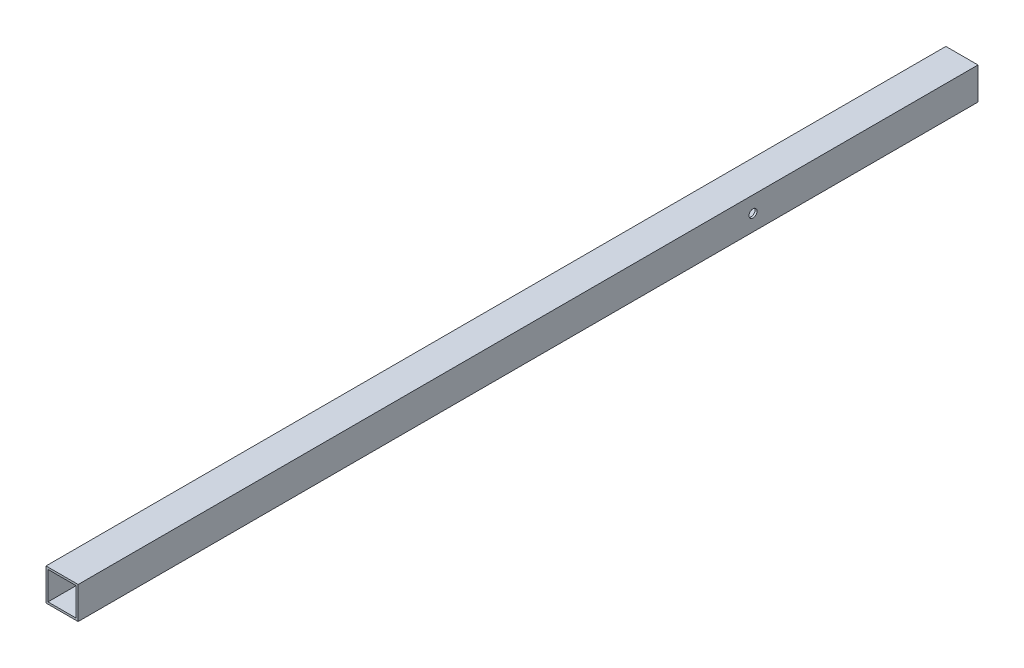
ISO-10303-21;
HEADER;
FILE_DESCRIPTION(('STEP AP214'),'2;1');
FILE_NAME('part.step','',(''),(''),'','','');
FILE_SCHEMA(('AUTOMOTIVE_DESIGN { 1 0 10303 214 1 1 1 1 }'));
ENDSEC;
DATA;
#1=APPLICATION_CONTEXT('core data for automotive mechanical design processes');
#2=APPLICATION_PROTOCOL_DEFINITION('international standard','automotive_design',2000,#1);
#3=PRODUCT_CONTEXT('',#1,'mechanical');
#4=PRODUCT('Part','Part','',(#3));
#5=PRODUCT_RELATED_PRODUCT_CATEGORY('part','',(#4));
#6=PRODUCT_DEFINITION_FORMATION('','',#4);
#7=PRODUCT_DEFINITION_CONTEXT('part definition',#1,'design');
#8=PRODUCT_DEFINITION('design','',#6,#7);
#9=PRODUCT_DEFINITION_SHAPE('','',#8);
#10=(LENGTH_UNIT() NAMED_UNIT(*) SI_UNIT(.MILLI.,.METRE.));
#11=(NAMED_UNIT(*) PLANE_ANGLE_UNIT() SI_UNIT($,.RADIAN.));
#12=(NAMED_UNIT(*) SI_UNIT($,.STERADIAN.) SOLID_ANGLE_UNIT());
#13=UNCERTAINTY_MEASURE_WITH_UNIT(LENGTH_MEASURE(1.E-05),#10,'distance_accuracy_value','');
#14=(GEOMETRIC_REPRESENTATION_CONTEXT(3) GLOBAL_UNCERTAINTY_ASSIGNED_CONTEXT((#13)) GLOBAL_UNIT_ASSIGNED_CONTEXT((#10,
#11,#12)) REPRESENTATION_CONTEXT('',''));
#15=CARTESIAN_POINT('',(0.,0.,0.));
#16=DIRECTION('',(0.,0.,1.));
#17=DIRECTION('',(1.,0.,0.));
#18=AXIS2_PLACEMENT_3D('',#15,#16,#17);
#19=CARTESIAN_POINT('',(-12.7,-12.7,914.4));
#20=DIRECTION('',(0.,1.,0.));
#21=DIRECTION('',(0.,0.,1.));
#22=AXIS2_PLACEMENT_3D('',#19,#20,#21);
#23=PLANE('',#22);
#24=CARTESIAN_POINT('',(0.,-12.7,-584.199999999997));
#25=DIRECTION('',(0.,-1.,0.));
#26=DIRECTION('',(0.,0.,-1.));
#27=AXIS2_PLACEMENT_3D('',#24,#25,#26);
#28=CIRCLE('',#27,2.55269999999999);
#29=CARTESIAN_POINT('',(0.,-12.7,-586.752699999997));
#30=VERTEX_POINT('',#29);
#31=EDGE_CURVE('E249',#30,#30,#28,.T.);
#32=ORIENTED_EDGE('',*,*,#31,.F.);
#33=EDGE_LOOP('',(#32));
#34=FACE_BOUND('',#33,.T.);
#35=CARTESIAN_POINT('',(0.,-12.7,-533.400000000002));
#36=DIRECTION('',(0.,-1.,0.));
#37=DIRECTION('',(0.,0.,-1.));
#38=AXIS2_PLACEMENT_3D('',#35,#36,#37);
#39=CIRCLE('',#38,2.55269999999999);
#40=CARTESIAN_POINT('',(0.,-12.7,-535.952700000002));
#41=VERTEX_POINT('',#40);
#42=EDGE_CURVE('E243',#41,#41,#39,.T.);
#43=ORIENTED_EDGE('',*,*,#42,.F.);
#44=EDGE_LOOP('',(#43));
#45=FACE_BOUND('',#44,.T.);
#46=CARTESIAN_POINT('',(0.,-12.7,-482.600000000002));
#47=DIRECTION('',(0.,-1.,0.));
#48=DIRECTION('',(0.,0.,-1.));
#49=AXIS2_PLACEMENT_3D('',#46,#47,#48);
#50=CIRCLE('',#49,2.55269999999999);
#51=CARTESIAN_POINT('',(0.,-12.7,-485.152700000002));
#52=VERTEX_POINT('',#51);
#53=EDGE_CURVE('E237',#52,#52,#50,.T.);
#54=ORIENTED_EDGE('',*,*,#53,.F.);
#55=EDGE_LOOP('',(#54));
#56=FACE_BOUND('',#55,.T.);
#57=CARTESIAN_POINT('',(1.52655665885959E-13,-12.7,-254.000000000002));
#58=DIRECTION('',(0.,-1.,0.));
#59=DIRECTION('',(0.,0.,-1.));
#60=AXIS2_PLACEMENT_3D('',#57,#58,#59);
#61=CIRCLE('',#60,2.38125);
#62=CARTESIAN_POINT('',(1.52655665885959E-13,-12.7,-256.381250000002));
#63=VERTEX_POINT('',#62);
#64=EDGE_CURVE('E207',#63,#63,#61,.T.);
#65=ORIENTED_EDGE('',*,*,#64,.F.);
#66=EDGE_LOOP('',(#65));
#67=FACE_BOUND('',#66,.T.);
#68=CARTESIAN_POINT('',(0.,-12.7,-228.600000000002));
#69=DIRECTION('',(0.,-1.,0.));
#70=DIRECTION('',(0.,0.,-1.));
#71=AXIS2_PLACEMENT_3D('',#68,#69,#70);
#72=CIRCLE('',#71,2.38125);
#73=CARTESIAN_POINT('',(0.,-12.7,-230.981250000002));
#74=VERTEX_POINT('',#73);
#75=EDGE_CURVE('E201',#74,#74,#72,.T.);
#76=ORIENTED_EDGE('',*,*,#75,.F.);
#77=EDGE_LOOP('',(#76));
#78=FACE_BOUND('',#77,.T.);
#79=DIRECTION('',(1.,0.,0.));
#80=VECTOR('',#79,1.);
#81=CARTESIAN_POINT('',(-12.7,-12.7,-203.2));
#82=LINE('',#81,#80);
#83=CARTESIAN_POINT('',(-12.7,-12.7,-203.199999999999));
#84=VERTEX_POINT('',#83);
#85=CARTESIAN_POINT('',(12.7,-12.7,-203.2));
#86=VERTEX_POINT('',#85);
#87=EDGE_CURVE('E167',#84,#86,#82,.T.);
#88=ORIENTED_EDGE('',*,*,#87,.F.);
#89=DIRECTION('',(0.,0.,-1.));
#90=VECTOR('',#89,1.);
#91=CARTESIAN_POINT('',(-12.7,-12.7,914.4));
#92=LINE('',#91,#90);
#93=CARTESIAN_POINT('',(-12.7,-12.7,-914.4));
#94=VERTEX_POINT('',#93);
#95=EDGE_CURVE('E132',#84,#94,#92,.T.);
#96=ORIENTED_EDGE('',*,*,#95,.T.);
#97=DIRECTION('',(1.,0.,0.));
#98=VECTOR('',#97,1.);
#99=CARTESIAN_POINT('',(-12.7,-12.7,-914.4));
#100=LINE('',#99,#98);
#101=CARTESIAN_POINT('',(12.7,-12.7,-914.4));
#102=VERTEX_POINT('',#101);
#103=EDGE_CURVE('E125',#94,#102,#100,.T.);
#104=ORIENTED_EDGE('',*,*,#103,.T.);
#105=DIRECTION('',(0.,0.,-1.));
#106=VECTOR('',#105,1.);
#107=CARTESIAN_POINT('',(12.7,-12.7,914.4));
#108=LINE('',#107,#106);
#109=EDGE_CURVE('E130',#86,#102,#108,.T.);
#110=ORIENTED_EDGE('',*,*,#109,.F.);
#111=EDGE_LOOP('',(#88,#96,#104,#110));
#112=FACE_BOUND('',#111,.T.);
#113=CARTESIAN_POINT('',(2.4980018054066E-13,-12.7,-279.400000000002));
#114=DIRECTION('',(0.,-1.,0.));
#115=DIRECTION('',(0.,0.,-1.));
#116=AXIS2_PLACEMENT_3D('',#113,#114,#115);
#117=CIRCLE('',#116,2.38125);
#118=CARTESIAN_POINT('',(2.4980018054066E-13,-12.7,-281.781250000002));
#119=VERTEX_POINT('',#118);
#120=EDGE_CURVE('E213',#119,#119,#117,.T.);
#121=ORIENTED_EDGE('',*,*,#120,.F.);
#122=EDGE_LOOP('',(#121));
#123=FACE_BOUND('',#122,.T.);
#124=CARTESIAN_POINT('',(2.4980018054066E-13,-12.7,-838.199999999997));
#125=DIRECTION('',(0.,-1.,0.));
#126=DIRECTION('',(0.,0.,-1.));
#127=AXIS2_PLACEMENT_3D('',#124,#125,#126);
#128=CIRCLE('',#127,2.38125);
#129=CARTESIAN_POINT('',(2.4980018054066E-13,-12.7,-840.581249999997));
#130=VERTEX_POINT('',#129);
#131=EDGE_CURVE('E219',#130,#130,#128,.T.);
#132=ORIENTED_EDGE('',*,*,#131,.F.);
#133=EDGE_LOOP('',(#132));
#134=FACE_BOUND('',#133,.T.);
#135=CARTESIAN_POINT('',(1.52655665885959E-13,-12.7,-863.599999999998));
#136=DIRECTION('',(0.,-1.,0.));
#137=DIRECTION('',(0.,0.,-1.));
#138=AXIS2_PLACEMENT_3D('',#135,#136,#137);
#139=CIRCLE('',#138,2.38125);
#140=CARTESIAN_POINT('',(1.52655665885959E-13,-12.7,-865.981249999997));
#141=VERTEX_POINT('',#140);
#142=EDGE_CURVE('E225',#141,#141,#139,.T.);
#143=ORIENTED_EDGE('',*,*,#142,.F.);
#144=EDGE_LOOP('',(#143));
#145=FACE_BOUND('',#144,.T.);
#146=CARTESIAN_POINT('',(0.,-12.7,-888.999999999997));
#147=DIRECTION('',(0.,-1.,0.));
#148=DIRECTION('',(0.,0.,-1.));
#149=AXIS2_PLACEMENT_3D('',#146,#147,#148);
#150=CIRCLE('',#149,2.38125);
#151=CARTESIAN_POINT('',(0.,-12.7,-891.381249999997));
#152=VERTEX_POINT('',#151);
#153=EDGE_CURVE('E231',#152,#152,#150,.T.);
#154=ORIENTED_EDGE('',*,*,#153,.F.);
#155=EDGE_LOOP('',(#154));
#156=FACE_BOUND('',#155,.T.);
#157=CARTESIAN_POINT('',(0.,-12.7,-634.999999999997));
#158=DIRECTION('',(0.,-1.,0.));
#159=DIRECTION('',(0.,0.,-1.));
#160=AXIS2_PLACEMENT_3D('',#157,#158,#159);
#161=CIRCLE('',#160,2.55269999999999);
#162=CARTESIAN_POINT('',(0.,-12.7,-637.552699999997));
#163=VERTEX_POINT('',#162);
#164=EDGE_CURVE('E255',#163,#163,#161,.T.);
#165=ORIENTED_EDGE('',*,*,#164,.F.);
#166=EDGE_LOOP('',(#165));
#167=FACE_BOUND('',#166,.T.);
#168=ADVANCED_FACE('F38',(#34,#45,#56,#67,#78,#112,#123,#134,#145,#156,#167),#23,.F.);
#169=CARTESIAN_POINT('',(12.7,-12.7,914.4));
#170=DIRECTION('',(-1.,0.,0.));
#171=DIRECTION('',(0.,0.,1.));
#172=AXIS2_PLACEMENT_3D('',#169,#170,#171);
#173=PLANE('',#172);
#174=CARTESIAN_POINT('',(12.7,0.,-736.6));
#175=DIRECTION('',(-1.,0.,0.));
#176=DIRECTION('',(0.,0.,1.));
#177=AXIS2_PLACEMENT_3D('',#174,#175,#176);
#178=CIRCLE('',#177,3.17499999999999);
#179=CARTESIAN_POINT('',(12.7,0.,-733.425));
#180=VERTEX_POINT('',#179);
#181=EDGE_CURVE('E192',#180,#180,#178,.T.);
#182=ORIENTED_EDGE('',*,*,#181,.T.);
#183=EDGE_LOOP('',(#182));
#184=FACE_BOUND('',#183,.T.);
#185=DIRECTION('',(0.,1.,0.));
#186=VECTOR('',#185,1.);
#187=CARTESIAN_POINT('',(12.7,-12.7,-203.2));
#188=LINE('',#187,#186);
#189=CARTESIAN_POINT('',(12.7,12.7,-203.2));
#190=VERTEX_POINT('',#189);
#191=EDGE_CURVE('E171',#86,#190,#188,.T.);
#192=ORIENTED_EDGE('',*,*,#191,.F.);
#193=ORIENTED_EDGE('',*,*,#109,.T.);
#194=DIRECTION('',(0.,1.,0.));
#195=VECTOR('',#194,1.);
#196=CARTESIAN_POINT('',(12.7,-12.7,-914.4));
#197=LINE('',#196,#195);
#198=CARTESIAN_POINT('',(12.7,12.7,-914.4));
#199=VERTEX_POINT('',#198);
#200=EDGE_CURVE('E153',#102,#199,#197,.T.);
#201=ORIENTED_EDGE('',*,*,#200,.T.);
#202=DIRECTION('',(0.,0.,-1.));
#203=VECTOR('',#202,1.);
#204=CARTESIAN_POINT('',(12.7,12.7,914.4));
#205=LINE('',#204,#203);
#206=EDGE_CURVE('E47',#190,#199,#205,.T.);
#207=ORIENTED_EDGE('',*,*,#206,.F.);
#208=EDGE_LOOP('',(#192,#193,#201,#207));
#209=FACE_BOUND('',#208,.T.);
#210=ADVANCED_FACE('F40',(#184,#209),#173,.F.);
#211=CARTESIAN_POINT('',(-12.7,12.7,914.4));
#212=DIRECTION('',(0.,-1.,0.));
#213=DIRECTION('',(0.,0.,-1.));
#214=AXIS2_PLACEMENT_3D('',#211,#212,#213);
#215=PLANE('',#214);
#216=DIRECTION('',(-1.,0.,0.));
#217=VECTOR('',#216,1.);
#218=CARTESIAN_POINT('',(-12.7,12.7,-203.2));
#219=LINE('',#218,#217);
#220=CARTESIAN_POINT('',(-12.7,12.7,-203.2));
#221=VERTEX_POINT('',#220);
#222=EDGE_CURVE('E144',#190,#221,#219,.T.);
#223=ORIENTED_EDGE('',*,*,#222,.F.);
#224=ORIENTED_EDGE('',*,*,#206,.T.);
#225=DIRECTION('',(-1.,0.,0.));
#226=VECTOR('',#225,1.);
#227=CARTESIAN_POINT('',(-12.7,12.7,-914.4));
#228=LINE('',#227,#226);
#229=CARTESIAN_POINT('',(-12.7,12.7,-914.4));
#230=VERTEX_POINT('',#229);
#231=EDGE_CURVE('E143',#199,#230,#228,.T.);
#232=ORIENTED_EDGE('',*,*,#231,.T.);
#233=DIRECTION('',(0.,0.,-1.));
#234=VECTOR('',#233,1.);
#235=CARTESIAN_POINT('',(-12.7,12.7,914.4));
#236=LINE('',#235,#234);
#237=EDGE_CURVE('E134',#221,#230,#236,.T.);
#238=ORIENTED_EDGE('',*,*,#237,.F.);
#239=EDGE_LOOP('',(#223,#224,#232,#238));
#240=FACE_BOUND('',#239,.T.);
#241=ADVANCED_FACE('F141',(#240),#215,.F.);
#242=CARTESIAN_POINT('',(-12.7,-12.7,914.4));
#243=DIRECTION('',(1.,0.,0.));
#244=DIRECTION('',(0.,0.,-1.));
#245=AXIS2_PLACEMENT_3D('',#242,#243,#244);
#246=PLANE('',#245);
#247=CARTESIAN_POINT('',(-12.7,0.,-736.6));
#248=DIRECTION('',(-1.,0.,0.));
#249=DIRECTION('',(0.,0.,1.));
#250=AXIS2_PLACEMENT_3D('',#247,#248,#249);
#251=CIRCLE('',#250,3.175);
#252=CARTESIAN_POINT('',(-12.7,0.,-733.425));
#253=VERTEX_POINT('',#252);
#254=EDGE_CURVE('E195',#253,#253,#251,.T.);
#255=ORIENTED_EDGE('',*,*,#254,.F.);
#256=EDGE_LOOP('',(#255));
#257=FACE_BOUND('',#256,.T.);
#258=DIRECTION('',(0.,-1.,0.));
#259=VECTOR('',#258,1.);
#260=CARTESIAN_POINT('',(-12.7,-12.7,-203.2));
#261=LINE('',#260,#259);
#262=EDGE_CURVE('E54',#221,#84,#261,.T.);
#263=ORIENTED_EDGE('',*,*,#262,.F.);
#264=ORIENTED_EDGE('',*,*,#237,.T.);
#265=DIRECTION('',(0.,-1.,0.));
#266=VECTOR('',#265,1.);
#267=CARTESIAN_POINT('',(-12.7,-12.7,-914.4));
#268=LINE('',#267,#266);
#269=EDGE_CURVE('E156',#230,#94,#268,.T.);
#270=ORIENTED_EDGE('',*,*,#269,.T.);
#271=ORIENTED_EDGE('',*,*,#95,.F.);
#272=EDGE_LOOP('',(#263,#264,#270,#271));
#273=FACE_BOUND('',#272,.T.);
#274=ADVANCED_FACE('F169',(#257,#273),#246,.F.);
#275=CARTESIAN_POINT('',(11.1125,-11.1125,914.4));
#276=DIRECTION('',(-1.,0.,0.));
#277=DIRECTION('',(0.,0.,1.));
#278=AXIS2_PLACEMENT_3D('',#275,#276,#277);
#279=PLANE('',#278);
#280=CARTESIAN_POINT('',(11.1125,0.,-736.6));
#281=DIRECTION('',(-1.,0.,0.));
#282=DIRECTION('',(0.,0.,1.));
#283=AXIS2_PLACEMENT_3D('',#280,#281,#282);
#284=CIRCLE('',#283,3.175);
#285=CARTESIAN_POINT('',(11.1125,0.,-733.425));
#286=VERTEX_POINT('',#285);
#287=EDGE_CURVE('E42',#286,#286,#284,.T.);
#288=ORIENTED_EDGE('',*,*,#287,.F.);
#289=EDGE_LOOP('',(#288));
#290=FACE_BOUND('',#289,.T.);
#291=DIRECTION('',(0.,0.,-1.));
#292=VECTOR('',#291,1.);
#293=CARTESIAN_POINT('',(11.1125,-11.1125,914.4));
#294=LINE('',#293,#292);
#295=CARTESIAN_POINT('',(11.1125,-11.1125,-203.199999999999));
#296=VERTEX_POINT('',#295);
#297=CARTESIAN_POINT('',(11.1125,-11.1125,-914.4));
#298=VERTEX_POINT('',#297);
#299=EDGE_CURVE('E121',#296,#298,#294,.T.);
#300=ORIENTED_EDGE('',*,*,#299,.F.);
#301=DIRECTION('',(0.,1.,0.));
#302=VECTOR('',#301,1.);
#303=CARTESIAN_POINT('',(11.1125,-11.1125,-203.2));
#304=LINE('',#303,#302);
#305=CARTESIAN_POINT('',(11.1125,11.1125,-203.2));
#306=VERTEX_POINT('',#305);
#307=EDGE_CURVE('E62',#296,#306,#304,.T.);
#308=ORIENTED_EDGE('',*,*,#307,.T.);
#309=DIRECTION('',(0.,0.,-1.));
#310=VECTOR('',#309,1.);
#311=CARTESIAN_POINT('',(11.1125,11.1125,914.4));
#312=LINE('',#311,#310);
#313=CARTESIAN_POINT('',(11.1125,11.1125,-914.4));
#314=VERTEX_POINT('',#313);
#315=EDGE_CURVE('E123',#306,#314,#312,.T.);
#316=ORIENTED_EDGE('',*,*,#315,.T.);
#317=DIRECTION('',(0.,1.,0.));
#318=VECTOR('',#317,1.);
#319=CARTESIAN_POINT('',(11.1125,-11.1125,-914.4));
#320=LINE('',#319,#318);
#321=EDGE_CURVE('E177',#298,#314,#320,.T.);
#322=ORIENTED_EDGE('',*,*,#321,.F.);
#323=EDGE_LOOP('',(#300,#308,#316,#322));
#324=FACE_BOUND('',#323,.T.);
#325=ADVANCED_FACE('F273',(#290,#324),#279,.T.);
#326=CARTESIAN_POINT('',(-11.1125,11.1125,914.4));
#327=DIRECTION('',(0.,-1.,0.));
#328=DIRECTION('',(0.,0.,-1.));
#329=AXIS2_PLACEMENT_3D('',#326,#327,#328);
#330=PLANE('',#329);
#331=ORIENTED_EDGE('',*,*,#315,.F.);
#332=DIRECTION('',(-1.,0.,0.));
#333=VECTOR('',#332,1.);
#334=CARTESIAN_POINT('',(-11.1125,11.1125,-203.2));
#335=LINE('',#334,#333);
#336=CARTESIAN_POINT('',(-11.1125,11.1125,-203.2));
#337=VERTEX_POINT('',#336);
#338=EDGE_CURVE('E114',#306,#337,#335,.T.);
#339=ORIENTED_EDGE('',*,*,#338,.T.);
#340=DIRECTION('',(0.,0.,-1.));
#341=VECTOR('',#340,1.);
#342=CARTESIAN_POINT('',(-11.1125,11.1125,914.4));
#343=LINE('',#342,#341);
#344=CARTESIAN_POINT('',(-11.1125,11.1125,-914.4));
#345=VERTEX_POINT('',#344);
#346=EDGE_CURVE('E113',#337,#345,#343,.T.);
#347=ORIENTED_EDGE('',*,*,#346,.T.);
#348=DIRECTION('',(-1.,0.,0.));
#349=VECTOR('',#348,1.);
#350=CARTESIAN_POINT('',(-11.1125,11.1125,-914.4));
#351=LINE('',#350,#349);
#352=EDGE_CURVE('E180',#314,#345,#351,.T.);
#353=ORIENTED_EDGE('',*,*,#352,.F.);
#354=EDGE_LOOP('',(#331,#339,#347,#353));
#355=FACE_BOUND('',#354,.T.);
#356=ADVANCED_FACE('F187',(#355),#330,.T.);
#357=CARTESIAN_POINT('',(-11.1125,-11.1125,914.4));
#358=DIRECTION('',(1.,0.,0.));
#359=DIRECTION('',(0.,0.,-1.));
#360=AXIS2_PLACEMENT_3D('',#357,#358,#359);
#361=PLANE('',#360);
#362=CARTESIAN_POINT('',(-11.1125,0.,-736.6));
#363=DIRECTION('',(1.,0.,0.));
#364=DIRECTION('',(0.,0.,-1.));
#365=AXIS2_PLACEMENT_3D('',#362,#363,#364);
#366=CIRCLE('',#365,3.175);
#367=CARTESIAN_POINT('',(-11.1125,0.,-739.775));
#368=VERTEX_POINT('',#367);
#369=EDGE_CURVE('E115',#368,#368,#366,.T.);
#370=ORIENTED_EDGE('',*,*,#369,.F.);
#371=EDGE_LOOP('',(#370));
#372=FACE_BOUND('',#371,.T.);
#373=ORIENTED_EDGE('',*,*,#346,.F.);
#374=DIRECTION('',(0.,-1.,0.));
#375=VECTOR('',#374,1.);
#376=CARTESIAN_POINT('',(-11.1125,-11.1125,-203.2));
#377=LINE('',#376,#375);
#378=CARTESIAN_POINT('',(-11.1125,-11.1125,-203.2));
#379=VERTEX_POINT('',#378);
#380=EDGE_CURVE('E102',#337,#379,#377,.T.);
#381=ORIENTED_EDGE('',*,*,#380,.T.);
#382=DIRECTION('',(0.,0.,-1.));
#383=VECTOR('',#382,1.);
#384=CARTESIAN_POINT('',(-11.1125,-11.1125,914.4));
#385=LINE('',#384,#383);
#386=CARTESIAN_POINT('',(-11.1125,-11.1125,-914.4));
#387=VERTEX_POINT('',#386);
#388=EDGE_CURVE('E111',#379,#387,#385,.T.);
#389=ORIENTED_EDGE('',*,*,#388,.T.);
#390=DIRECTION('',(0.,-1.,0.));
#391=VECTOR('',#390,1.);
#392=CARTESIAN_POINT('',(-11.1125,-11.1125,-914.4));
#393=LINE('',#392,#391);
#394=EDGE_CURVE('E160',#345,#387,#393,.T.);
#395=ORIENTED_EDGE('',*,*,#394,.F.);
#396=EDGE_LOOP('',(#373,#381,#389,#395));
#397=FACE_BOUND('',#396,.T.);
#398=ADVANCED_FACE('F109',(#372,#397),#361,.T.);
#399=CARTESIAN_POINT('',(-11.1125,-11.1125,914.4));
#400=DIRECTION('',(0.,1.,0.));
#401=DIRECTION('',(0.,0.,1.));
#402=AXIS2_PLACEMENT_3D('',#399,#400,#401);
#403=PLANE('',#402);
#404=CARTESIAN_POINT('',(0.,-11.1125,-634.999999999997));
#405=DIRECTION('',(0.,1.,0.));
#406=DIRECTION('',(0.,0.,1.));
#407=AXIS2_PLACEMENT_3D('',#404,#405,#406);
#408=CIRCLE('',#407,2.55269999999999);
#409=CARTESIAN_POINT('',(0.,-11.1125,-632.447299999997));
#410=VERTEX_POINT('',#409);
#411=EDGE_CURVE('E252',#410,#410,#408,.T.);
#412=ORIENTED_EDGE('',*,*,#411,.F.);
#413=EDGE_LOOP('',(#412));
#414=FACE_BOUND('',#413,.T.);
#415=CARTESIAN_POINT('',(0.,-11.1125,-584.199999999997));
#416=DIRECTION('',(0.,1.,0.));
#417=DIRECTION('',(0.,0.,1.));
#418=AXIS2_PLACEMENT_3D('',#415,#416,#417);
#419=CIRCLE('',#418,2.55269999999999);
#420=CARTESIAN_POINT('',(0.,-11.1125,-581.647299999997));
#421=VERTEX_POINT('',#420);
#422=EDGE_CURVE('E246',#421,#421,#419,.T.);
#423=ORIENTED_EDGE('',*,*,#422,.F.);
#424=EDGE_LOOP('',(#423));
#425=FACE_BOUND('',#424,.T.);
#426=CARTESIAN_POINT('',(0.,-11.1125,-533.400000000002));
#427=DIRECTION('',(0.,1.,0.));
#428=DIRECTION('',(0.,0.,1.));
#429=AXIS2_PLACEMENT_3D('',#426,#427,#428);
#430=CIRCLE('',#429,2.55269999999999);
#431=CARTESIAN_POINT('',(0.,-11.1125,-530.847300000002));
#432=VERTEX_POINT('',#431);
#433=EDGE_CURVE('E240',#432,#432,#430,.T.);
#434=ORIENTED_EDGE('',*,*,#433,.F.);
#435=EDGE_LOOP('',(#434));
#436=FACE_BOUND('',#435,.T.);
#437=CARTESIAN_POINT('',(0.,-11.1125,-482.600000000002));
#438=DIRECTION('',(0.,1.,0.));
#439=DIRECTION('',(0.,0.,1.));
#440=AXIS2_PLACEMENT_3D('',#437,#438,#439);
#441=CIRCLE('',#440,2.55269999999999);
#442=CARTESIAN_POINT('',(0.,-11.1125,-480.047300000002));
#443=VERTEX_POINT('',#442);
#444=EDGE_CURVE('E234',#443,#443,#441,.T.);
#445=ORIENTED_EDGE('',*,*,#444,.F.);
#446=EDGE_LOOP('',(#445));
#447=FACE_BOUND('',#446,.T.);
#448=CARTESIAN_POINT('',(0.,-11.1125,-888.999999999997));
#449=DIRECTION('',(0.,1.,0.));
#450=DIRECTION('',(0.,0.,1.));
#451=AXIS2_PLACEMENT_3D('',#448,#449,#450);
#452=CIRCLE('',#451,2.38125);
#453=CARTESIAN_POINT('',(0.,-11.1125,-886.618749999997));
#454=VERTEX_POINT('',#453);
#455=EDGE_CURVE('E228',#454,#454,#452,.T.);
#456=ORIENTED_EDGE('',*,*,#455,.F.);
#457=EDGE_LOOP('',(#456));
#458=FACE_BOUND('',#457,.T.);
#459=CARTESIAN_POINT('',(1.52655665885959E-13,-11.1125,-863.599999999998));
#460=DIRECTION('',(0.,1.,0.));
#461=DIRECTION('',(0.,0.,1.));
#462=AXIS2_PLACEMENT_3D('',#459,#460,#461);
#463=CIRCLE('',#462,2.38125);
#464=CARTESIAN_POINT('',(1.52655665885959E-13,-11.1125,-861.218749999997));
#465=VERTEX_POINT('',#464);
#466=EDGE_CURVE('E222',#465,#465,#463,.T.);
#467=ORIENTED_EDGE('',*,*,#466,.F.);
#468=EDGE_LOOP('',(#467));
#469=FACE_BOUND('',#468,.T.);
#470=CARTESIAN_POINT('',(2.4980018054066E-13,-11.1125,-838.199999999997));
#471=DIRECTION('',(0.,1.,0.));
#472=DIRECTION('',(0.,0.,1.));
#473=AXIS2_PLACEMENT_3D('',#470,#471,#472);
#474=CIRCLE('',#473,2.38125);
#475=CARTESIAN_POINT('',(2.4980018054066E-13,-11.1125,-835.818749999997));
#476=VERTEX_POINT('',#475);
#477=EDGE_CURVE('E216',#476,#476,#474,.T.);
#478=ORIENTED_EDGE('',*,*,#477,.F.);
#479=EDGE_LOOP('',(#478));
#480=FACE_BOUND('',#479,.T.);
#481=CARTESIAN_POINT('',(2.4980018054066E-13,-11.1125,-279.400000000002));
#482=DIRECTION('',(0.,1.,0.));
#483=DIRECTION('',(0.,0.,1.));
#484=AXIS2_PLACEMENT_3D('',#481,#482,#483);
#485=CIRCLE('',#484,2.38125);
#486=CARTESIAN_POINT('',(2.4980018054066E-13,-11.1125,-277.018750000002));
#487=VERTEX_POINT('',#486);
#488=EDGE_CURVE('E210',#487,#487,#485,.T.);
#489=ORIENTED_EDGE('',*,*,#488,.F.);
#490=EDGE_LOOP('',(#489));
#491=FACE_BOUND('',#490,.T.);
#492=CARTESIAN_POINT('',(1.52655665885959E-13,-11.1125,-254.000000000002));
#493=DIRECTION('',(0.,1.,0.));
#494=DIRECTION('',(0.,0.,1.));
#495=AXIS2_PLACEMENT_3D('',#492,#493,#494);
#496=CIRCLE('',#495,2.38125);
#497=CARTESIAN_POINT('',(1.52655665885959E-13,-11.1125,-251.618750000002));
#498=VERTEX_POINT('',#497);
#499=EDGE_CURVE('E204',#498,#498,#496,.T.);
#500=ORIENTED_EDGE('',*,*,#499,.F.);
#501=EDGE_LOOP('',(#500));
#502=FACE_BOUND('',#501,.T.);
#503=CARTESIAN_POINT('',(0.,-11.1125,-228.600000000002));
#504=DIRECTION('',(0.,1.,0.));
#505=DIRECTION('',(0.,0.,1.));
#506=AXIS2_PLACEMENT_3D('',#503,#504,#505);
#507=CIRCLE('',#506,2.38125);
#508=CARTESIAN_POINT('',(0.,-11.1125,-226.218750000002));
#509=VERTEX_POINT('',#508);
#510=EDGE_CURVE('E198',#509,#509,#507,.T.);
#511=ORIENTED_EDGE('',*,*,#510,.F.);
#512=EDGE_LOOP('',(#511));
#513=FACE_BOUND('',#512,.T.);
#514=ORIENTED_EDGE('',*,*,#388,.F.);
#515=DIRECTION('',(1.,0.,0.));
#516=VECTOR('',#515,1.);
#517=CARTESIAN_POINT('',(-11.1125,-11.1125,-203.2));
#518=LINE('',#517,#516);
#519=EDGE_CURVE('E11',#379,#296,#518,.T.);
#520=ORIENTED_EDGE('',*,*,#519,.T.);
#521=ORIENTED_EDGE('',*,*,#299,.T.);
#522=DIRECTION('',(1.,0.,0.));
#523=VECTOR('',#522,1.);
#524=CARTESIAN_POINT('',(-11.1125,-11.1125,-914.4));
#525=LINE('',#524,#523);
#526=EDGE_CURVE('E119',#387,#298,#525,.T.);
#527=ORIENTED_EDGE('',*,*,#526,.F.);
#528=EDGE_LOOP('',(#514,#520,#521,#527));
#529=FACE_BOUND('',#528,.T.);
#530=ADVANCED_FACE('F117',(#414,#425,#436,#447,#458,#469,#480,#491,#502,#513,#529),#403,.T.);
#531=CARTESIAN_POINT('',(0.,0.,-914.4));
#532=DIRECTION('',(0.,0.,-1.));
#533=DIRECTION('',(-1.,0.,0.));
#534=AXIS2_PLACEMENT_3D('',#531,#532,#533);
#535=PLANE('',#534);
#536=ORIENTED_EDGE('',*,*,#321,.T.);
#537=ORIENTED_EDGE('',*,*,#352,.T.);
#538=ORIENTED_EDGE('',*,*,#394,.T.);
#539=ORIENTED_EDGE('',*,*,#526,.T.);
#540=EDGE_LOOP('',(#536,#537,#538,#539));
#541=FACE_BOUND('',#540,.T.);
#542=ORIENTED_EDGE('',*,*,#200,.F.);
#543=ORIENTED_EDGE('',*,*,#103,.F.);
#544=ORIENTED_EDGE('',*,*,#269,.F.);
#545=ORIENTED_EDGE('',*,*,#231,.F.);
#546=EDGE_LOOP('',(#542,#543,#544,#545));
#547=FACE_BOUND('',#546,.T.);
#548=ADVANCED_FACE('F151',(#541,#547),#535,.T.);
#549=CARTESIAN_POINT('',(0.,0.,-203.2));
#550=DIRECTION('',(0.,0.,1.));
#551=DIRECTION('',(1.,0.,0.));
#552=AXIS2_PLACEMENT_3D('',#549,#550,#551);
#553=PLANE('',#552);
#554=ORIENTED_EDGE('',*,*,#519,.F.);
#555=ORIENTED_EDGE('',*,*,#380,.F.);
#556=ORIENTED_EDGE('',*,*,#338,.F.);
#557=ORIENTED_EDGE('',*,*,#307,.F.);
#558=EDGE_LOOP('',(#554,#555,#556,#557));
#559=FACE_BOUND('',#558,.T.);
#560=ORIENTED_EDGE('',*,*,#191,.T.);
#561=ORIENTED_EDGE('',*,*,#222,.T.);
#562=ORIENTED_EDGE('',*,*,#262,.T.);
#563=ORIENTED_EDGE('',*,*,#87,.T.);
#564=EDGE_LOOP('',(#560,#561,#562,#563));
#565=FACE_BOUND('',#564,.T.);
#566=ADVANCED_FACE('F101',(#559,#565),#553,.T.);
#567=CARTESIAN_POINT('',(-12.7,0.,-736.6));
#568=DIRECTION('',(-1.,0.,0.));
#569=DIRECTION('',(0.,0.,1.));
#570=AXIS2_PLACEMENT_3D('',#567,#568,#569);
#571=CYLINDRICAL_SURFACE('',#570,3.175);
#572=ORIENTED_EDGE('',*,*,#287,.T.);
#573=EDGE_LOOP('',(#572));
#574=FACE_BOUND('',#573,.T.);
#575=ORIENTED_EDGE('',*,*,#181,.F.);
#576=EDGE_LOOP('',(#575));
#577=FACE_BOUND('',#576,.T.);
#578=ADVANCED_FACE('F325',(#574,#577),#571,.F.);
#579=ORIENTED_EDGE('',*,*,#369,.T.);
#580=EDGE_LOOP('',(#579));
#581=FACE_BOUND('',#580,.T.);
#582=ORIENTED_EDGE('',*,*,#254,.T.);
#583=EDGE_LOOP('',(#582));
#584=FACE_BOUND('',#583,.T.);
#585=ADVANCED_FACE('F331',(#581,#584),#571,.F.);
#586=CARTESIAN_POINT('',(0.,-12.7,-228.600000000002));
#587=DIRECTION('',(0.,-1.,0.));
#588=DIRECTION('',(0.,0.,-1.));
#589=AXIS2_PLACEMENT_3D('',#586,#587,#588);
#590=CYLINDRICAL_SURFACE('',#589,2.38125);
#591=ORIENTED_EDGE('',*,*,#75,.T.);
#592=EDGE_LOOP('',(#591));
#593=FACE_BOUND('',#592,.T.);
#594=ORIENTED_EDGE('',*,*,#510,.T.);
#595=EDGE_LOOP('',(#594));
#596=FACE_BOUND('',#595,.T.);
#597=ADVANCED_FACE('F339',(#593,#596),#590,.F.);
#598=CARTESIAN_POINT('',(1.52655665885959E-13,-12.7,-254.000000000002));
#599=DIRECTION('',(0.,-1.,0.));
#600=DIRECTION('',(0.,0.,-1.));
#601=AXIS2_PLACEMENT_3D('',#598,#599,#600);
#602=CYLINDRICAL_SURFACE('',#601,2.38125);
#603=ORIENTED_EDGE('',*,*,#64,.T.);
#604=EDGE_LOOP('',(#603));
#605=FACE_BOUND('',#604,.T.);
#606=ORIENTED_EDGE('',*,*,#499,.T.);
#607=EDGE_LOOP('',(#606));
#608=FACE_BOUND('',#607,.T.);
#609=ADVANCED_FACE('F346',(#605,#608),#602,.F.);
#610=CARTESIAN_POINT('',(2.4980018054066E-13,-12.7,-279.400000000002));
#611=DIRECTION('',(0.,-1.,0.));
#612=DIRECTION('',(0.,0.,-1.));
#613=AXIS2_PLACEMENT_3D('',#610,#611,#612);
#614=CYLINDRICAL_SURFACE('',#613,2.38125);
#615=ORIENTED_EDGE('',*,*,#120,.T.);
#616=EDGE_LOOP('',(#615));
#617=FACE_BOUND('',#616,.T.);
#618=ORIENTED_EDGE('',*,*,#488,.T.);
#619=EDGE_LOOP('',(#618));
#620=FACE_BOUND('',#619,.T.);
#621=ADVANCED_FACE('F354',(#617,#620),#614,.F.);
#622=CARTESIAN_POINT('',(2.4980018054066E-13,-12.7,-838.199999999997));
#623=DIRECTION('',(0.,-1.,0.));
#624=DIRECTION('',(0.,0.,-1.));
#625=AXIS2_PLACEMENT_3D('',#622,#623,#624);
#626=CYLINDRICAL_SURFACE('',#625,2.38125);
#627=ORIENTED_EDGE('',*,*,#131,.T.);
#628=EDGE_LOOP('',(#627));
#629=FACE_BOUND('',#628,.T.);
#630=ORIENTED_EDGE('',*,*,#477,.T.);
#631=EDGE_LOOP('',(#630));
#632=FACE_BOUND('',#631,.T.);
#633=ADVANCED_FACE('F362',(#629,#632),#626,.F.);
#634=CARTESIAN_POINT('',(1.52655665885959E-13,-12.7,-863.599999999998));
#635=DIRECTION('',(0.,-1.,0.));
#636=DIRECTION('',(0.,0.,-1.));
#637=AXIS2_PLACEMENT_3D('',#634,#635,#636);
#638=CYLINDRICAL_SURFACE('',#637,2.38125);
#639=ORIENTED_EDGE('',*,*,#142,.T.);
#640=EDGE_LOOP('',(#639));
#641=FACE_BOUND('',#640,.T.);
#642=ORIENTED_EDGE('',*,*,#466,.T.);
#643=EDGE_LOOP('',(#642));
#644=FACE_BOUND('',#643,.T.);
#645=ADVANCED_FACE('F370',(#641,#644),#638,.F.);
#646=CARTESIAN_POINT('',(0.,-12.7,-888.999999999997));
#647=DIRECTION('',(0.,-1.,0.));
#648=DIRECTION('',(0.,0.,-1.));
#649=AXIS2_PLACEMENT_3D('',#646,#647,#648);
#650=CYLINDRICAL_SURFACE('',#649,2.38125);
#651=ORIENTED_EDGE('',*,*,#153,.T.);
#652=EDGE_LOOP('',(#651));
#653=FACE_BOUND('',#652,.T.);
#654=ORIENTED_EDGE('',*,*,#455,.T.);
#655=EDGE_LOOP('',(#654));
#656=FACE_BOUND('',#655,.T.);
#657=ADVANCED_FACE('F378',(#653,#656),#650,.F.);
#658=CARTESIAN_POINT('',(0.,-12.7,-482.600000000002));
#659=DIRECTION('',(0.,-1.,0.));
#660=DIRECTION('',(0.,0.,-1.));
#661=AXIS2_PLACEMENT_3D('',#658,#659,#660);
#662=CYLINDRICAL_SURFACE('',#661,2.55269999999999);
#663=ORIENTED_EDGE('',*,*,#53,.T.);
#664=EDGE_LOOP('',(#663));
#665=FACE_BOUND('',#664,.T.);
#666=ORIENTED_EDGE('',*,*,#444,.T.);
#667=EDGE_LOOP('',(#666));
#668=FACE_BOUND('',#667,.T.);
#669=ADVANCED_FACE('F386',(#665,#668),#662,.F.);
#670=CARTESIAN_POINT('',(0.,-12.7,-533.400000000002));
#671=DIRECTION('',(0.,-1.,0.));
#672=DIRECTION('',(0.,0.,-1.));
#673=AXIS2_PLACEMENT_3D('',#670,#671,#672);
#674=CYLINDRICAL_SURFACE('',#673,2.55269999999999);
#675=ORIENTED_EDGE('',*,*,#42,.T.);
#676=EDGE_LOOP('',(#675));
#677=FACE_BOUND('',#676,.T.);
#678=ORIENTED_EDGE('',*,*,#433,.T.);
#679=EDGE_LOOP('',(#678));
#680=FACE_BOUND('',#679,.T.);
#681=ADVANCED_FACE('F393',(#677,#680),#674,.F.);
#682=CARTESIAN_POINT('',(0.,-12.7,-584.199999999997));
#683=DIRECTION('',(0.,-1.,0.));
#684=DIRECTION('',(0.,0.,-1.));
#685=AXIS2_PLACEMENT_3D('',#682,#683,#684);
#686=CYLINDRICAL_SURFACE('',#685,2.55269999999999);
#687=ORIENTED_EDGE('',*,*,#31,.T.);
#688=EDGE_LOOP('',(#687));
#689=FACE_BOUND('',#688,.T.);
#690=ORIENTED_EDGE('',*,*,#422,.T.);
#691=EDGE_LOOP('',(#690));
#692=FACE_BOUND('',#691,.T.);
#693=ADVANCED_FACE('F401',(#689,#692),#686,.F.);
#694=CARTESIAN_POINT('',(0.,-12.7,-634.999999999997));
#695=DIRECTION('',(0.,-1.,0.));
#696=DIRECTION('',(0.,0.,-1.));
#697=AXIS2_PLACEMENT_3D('',#694,#695,#696);
#698=CYLINDRICAL_SURFACE('',#697,2.55269999999999);
#699=ORIENTED_EDGE('',*,*,#164,.T.);
#700=EDGE_LOOP('',(#699));
#701=FACE_BOUND('',#700,.T.);
#702=ORIENTED_EDGE('',*,*,#411,.T.);
#703=EDGE_LOOP('',(#702));
#704=FACE_BOUND('',#703,.T.);
#705=ADVANCED_FACE('F259',(#701,#704),#698,.F.);
#706=CLOSED_SHELL('',(#168,#210,#241,#274,#325,#356,#398,#530,#548,#566,#578,#585,#597,#609,
#621,#633,#645,#657,#669,#681,#693,#705));
#707=MANIFOLD_SOLID_BREP('B2',#706);
#708=ADVANCED_BREP_SHAPE_REPRESENTATION('',(#18,#707),#14);
#709=SHAPE_DEFINITION_REPRESENTATION(#9,#708);
ENDSEC;
END-ISO-10303-21;
